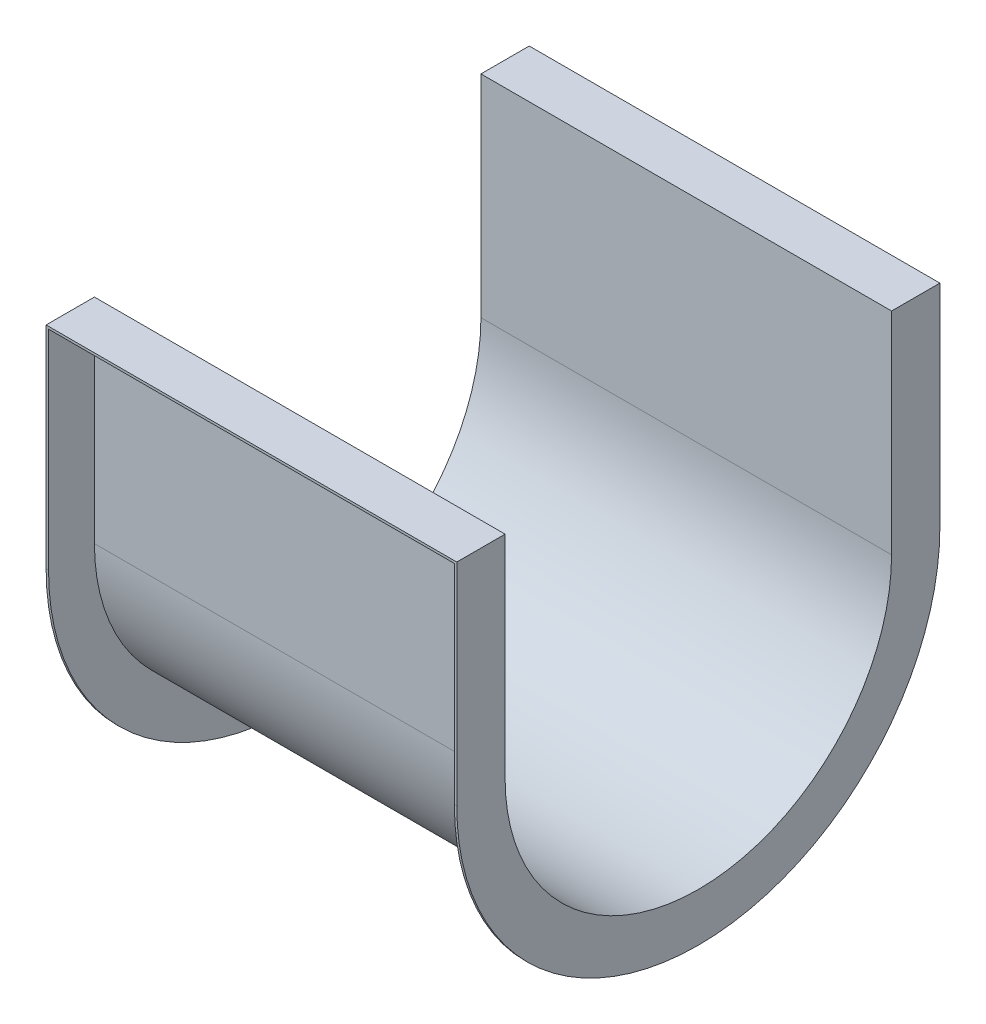
ISO-10303-21;
HEADER;
FILE_DESCRIPTION(('STEP AP214'),'2;1');
FILE_NAME('part.step','',(''),(''),'','','');
FILE_SCHEMA(('AUTOMOTIVE_DESIGN { 1 0 10303 214 1 1 1 1 }'));
ENDSEC;
DATA;
#1=APPLICATION_CONTEXT('core data for automotive mechanical design processes');
#2=APPLICATION_PROTOCOL_DEFINITION('international standard','automotive_design',2000,#1);
#3=PRODUCT_CONTEXT('',#1,'mechanical');
#4=PRODUCT('Part','Part','',(#3));
#5=PRODUCT_RELATED_PRODUCT_CATEGORY('part','',(#4));
#6=PRODUCT_DEFINITION_FORMATION('','',#4);
#7=PRODUCT_DEFINITION_CONTEXT('part definition',#1,'design');
#8=PRODUCT_DEFINITION('design','',#6,#7);
#9=PRODUCT_DEFINITION_SHAPE('','',#8);
#10=(LENGTH_UNIT() NAMED_UNIT(*) SI_UNIT(.MILLI.,.METRE.));
#11=(NAMED_UNIT(*) PLANE_ANGLE_UNIT() SI_UNIT($,.RADIAN.));
#12=(NAMED_UNIT(*) SI_UNIT($,.STERADIAN.) SOLID_ANGLE_UNIT());
#13=UNCERTAINTY_MEASURE_WITH_UNIT(LENGTH_MEASURE(1.E-05),#10,'distance_accuracy_value','');
#14=(GEOMETRIC_REPRESENTATION_CONTEXT(3) GLOBAL_UNCERTAINTY_ASSIGNED_CONTEXT((#13)) GLOBAL_UNIT_ASSIGNED_CONTEXT((#10,
#11,#12)) REPRESENTATION_CONTEXT('',''));
#15=CARTESIAN_POINT('',(0.,0.,0.));
#16=DIRECTION('',(0.,0.,1.));
#17=DIRECTION('',(1.,0.,0.));
#18=AXIS2_PLACEMENT_3D('',#15,#16,#17);
#19=CARTESIAN_POINT('',(170.,0.,-100.));
#20=DIRECTION('',(0.,0.,1.));
#21=DIRECTION('',(0.,-1.,0.));
#22=AXIS2_PLACEMENT_3D('',#19,#20,#21);
#23=PLANE('',#22);
#24=DIRECTION('',(0.,1.,0.));
#25=VECTOR('',#24,1.);
#26=CARTESIAN_POINT('',(1.,0.,-100.));
#27=LINE('',#26,#25);
#28=CARTESIAN_POINT('',(1.,-83.7,-100.));
#29=VERTEX_POINT('',#28);
#30=CARTESIAN_POINT('',(1.,2.7,-100.));
#31=VERTEX_POINT('',#30);
#32=EDGE_CURVE('E164',#29,#31,#27,.T.);
#33=ORIENTED_EDGE('',*,*,#32,.F.);
#34=DIRECTION('',(-1.,0.,0.));
#35=VECTOR('',#34,1.);
#36=CARTESIAN_POINT('',(170.,-83.7,-100.));
#37=LINE('',#36,#35);
#38=CARTESIAN_POINT('',(0.,-83.7,-100.));
#39=VERTEX_POINT('',#38);
#40=EDGE_CURVE('E78',#29,#39,#37,.T.);
#41=ORIENTED_EDGE('',*,*,#40,.T.);
#42=DIRECTION('',(0.,1.,0.));
#43=VECTOR('',#42,1.);
#44=CARTESIAN_POINT('',(0.,0.,-100.));
#45=LINE('',#44,#43);
#46=CARTESIAN_POINT('',(0.,3.7,-100.));
#47=VERTEX_POINT('',#46);
#48=EDGE_CURVE('E227',#39,#47,#45,.T.);
#49=ORIENTED_EDGE('',*,*,#48,.T.);
#50=DIRECTION('',(-1.,0.,0.));
#51=VECTOR('',#50,1.);
#52=CARTESIAN_POINT('',(0.,3.7,-100.));
#53=LINE('',#52,#51);
#54=CARTESIAN_POINT('',(170.,3.7,-100.));
#55=VERTEX_POINT('',#54);
#56=EDGE_CURVE('E224',#55,#47,#53,.T.);
#57=ORIENTED_EDGE('',*,*,#56,.F.);
#58=DIRECTION('',(0.,1.,0.));
#59=VECTOR('',#58,1.);
#60=CARTESIAN_POINT('',(170.,0.,-100.));
#61=LINE('',#60,#59);
#62=CARTESIAN_POINT('',(170.,-83.7,-100.));
#63=VERTEX_POINT('',#62);
#64=EDGE_CURVE('E228',#63,#55,#61,.T.);
#65=ORIENTED_EDGE('',*,*,#64,.F.);
#66=CARTESIAN_POINT('',(169.,-83.7,-100.));
#67=VERTEX_POINT('',#66);
#68=EDGE_CURVE('E251',#63,#67,#37,.T.);
#69=ORIENTED_EDGE('',*,*,#68,.T.);
#70=DIRECTION('',(0.,1.,0.));
#71=VECTOR('',#70,1.);
#72=CARTESIAN_POINT('',(169.,0.,-100.));
#73=LINE('',#72,#71);
#74=CARTESIAN_POINT('',(169.,2.7,-100.));
#75=VERTEX_POINT('',#74);
#76=EDGE_CURVE('E47',#67,#75,#73,.T.);
#77=ORIENTED_EDGE('',*,*,#76,.T.);
#78=DIRECTION('',(-1.,0.,0.));
#79=VECTOR('',#78,1.);
#80=CARTESIAN_POINT('',(170.,2.7,-100.));
#81=LINE('',#80,#79);
#82=EDGE_CURVE('E201',#75,#31,#81,.T.);
#83=ORIENTED_EDGE('',*,*,#82,.T.);
#84=EDGE_LOOP('',(#33,#41,#49,#57,#65,#69,#77,#83));
#85=FACE_BOUND('',#84,.T.);
#86=ADVANCED_FACE('F33',(#85),#23,.F.);
#87=CARTESIAN_POINT('',(170.,0.,100.));
#88=DIRECTION('',(0.,0.,-1.));
#89=DIRECTION('',(0.,1.,0.));
#90=AXIS2_PLACEMENT_3D('',#87,#88,#89);
#91=PLANE('',#90);
#92=DIRECTION('',(0.,-1.,0.));
#93=VECTOR('',#92,1.);
#94=CARTESIAN_POINT('',(1.,0.,100.));
#95=LINE('',#94,#93);
#96=CARTESIAN_POINT('',(1.,2.7,100.));
#97=VERTEX_POINT('',#96);
#98=CARTESIAN_POINT('',(1.,-83.7,100.));
#99=VERTEX_POINT('',#98);
#100=EDGE_CURVE('E196',#97,#99,#95,.T.);
#101=ORIENTED_EDGE('',*,*,#100,.F.);
#102=DIRECTION('',(1.,0.,0.));
#103=VECTOR('',#102,1.);
#104=CARTESIAN_POINT('',(0.,2.7,100.));
#105=LINE('',#104,#103);
#106=CARTESIAN_POINT('',(169.,2.7,100.));
#107=VERTEX_POINT('',#106);
#108=EDGE_CURVE('E175',#97,#107,#105,.T.);
#109=ORIENTED_EDGE('',*,*,#108,.T.);
#110=DIRECTION('',(0.,-1.,0.));
#111=VECTOR('',#110,1.);
#112=CARTESIAN_POINT('',(169.,0.,100.));
#113=LINE('',#112,#111);
#114=CARTESIAN_POINT('',(169.,-83.7,100.));
#115=VERTEX_POINT('',#114);
#116=EDGE_CURVE('E192',#107,#115,#113,.T.);
#117=ORIENTED_EDGE('',*,*,#116,.T.);
#118=DIRECTION('',(-1.,0.,0.));
#119=VECTOR('',#118,1.);
#120=CARTESIAN_POINT('',(170.,-83.7,100.));
#121=LINE('',#120,#119);
#122=CARTESIAN_POINT('',(170.,-83.7,100.));
#123=VERTEX_POINT('',#122);
#124=EDGE_CURVE('E255',#123,#115,#121,.T.);
#125=ORIENTED_EDGE('',*,*,#124,.F.);
#126=DIRECTION('',(0.,-1.,0.));
#127=VECTOR('',#126,1.);
#128=CARTESIAN_POINT('',(170.,0.,100.));
#129=LINE('',#128,#127);
#130=CARTESIAN_POINT('',(170.,3.7,100.));
#131=VERTEX_POINT('',#130);
#132=EDGE_CURVE('E236',#131,#123,#129,.T.);
#133=ORIENTED_EDGE('',*,*,#132,.F.);
#134=DIRECTION('',(1.,0.,0.));
#135=VECTOR('',#134,1.);
#136=CARTESIAN_POINT('',(170.,3.7,100.));
#137=LINE('',#136,#135);
#138=CARTESIAN_POINT('',(0.,3.7,100.));
#139=VERTEX_POINT('',#138);
#140=EDGE_CURVE('E212',#139,#131,#137,.T.);
#141=ORIENTED_EDGE('',*,*,#140,.F.);
#142=DIRECTION('',(0.,-1.,0.));
#143=VECTOR('',#142,1.);
#144=CARTESIAN_POINT('',(0.,0.,100.));
#145=LINE('',#144,#143);
#146=CARTESIAN_POINT('',(0.,-83.7,100.));
#147=VERTEX_POINT('',#146);
#148=EDGE_CURVE('E247',#139,#147,#145,.T.);
#149=ORIENTED_EDGE('',*,*,#148,.T.);
#150=EDGE_CURVE('E254',#99,#147,#121,.T.);
#151=ORIENTED_EDGE('',*,*,#150,.F.);
#152=EDGE_LOOP('',(#101,#109,#117,#125,#133,#141,#149,#151));
#153=FACE_BOUND('',#152,.T.);
#154=ADVANCED_FACE('F277',(#153),#91,.F.);
#155=CARTESIAN_POINT('',(170.,-83.7,0.));
#156=DIRECTION('',(-1.,0.,0.));
#157=DIRECTION('',(0.,0.,1.));
#158=AXIS2_PLACEMENT_3D('',#155,#156,#157);
#159=CYLINDRICAL_SURFACE('',#158,100.);
#160=CARTESIAN_POINT('',(1.,-83.7,0.));
#161=DIRECTION('',(1.,0.,0.));
#162=DIRECTION('',(0.,0.,-1.));
#163=AXIS2_PLACEMENT_3D('',#160,#161,#162);
#164=CIRCLE('',#163,100.);
#165=EDGE_CURVE('E188',#99,#29,#164,.T.);
#166=ORIENTED_EDGE('',*,*,#165,.F.);
#167=ORIENTED_EDGE('',*,*,#150,.T.);
#168=CARTESIAN_POINT('',(0.,-83.7,0.));
#169=DIRECTION('',(1.,0.,0.));
#170=DIRECTION('',(0.,0.,-1.));
#171=AXIS2_PLACEMENT_3D('',#168,#169,#170);
#172=CIRCLE('',#171,100.);
#173=EDGE_CURVE('E230',#147,#39,#172,.T.);
#174=ORIENTED_EDGE('',*,*,#173,.T.);
#175=ORIENTED_EDGE('',*,*,#40,.F.);
#176=EDGE_LOOP('',(#166,#167,#174,#175));
#177=FACE_BOUND('',#176,.T.);
#178=ADVANCED_FACE('F312',(#177),#159,.T.);
#179=CARTESIAN_POINT('',(170.,0.,-80.));
#180=DIRECTION('',(0.,0.,-1.));
#181=DIRECTION('',(-1.,0.,0.));
#182=AXIS2_PLACEMENT_3D('',#179,#180,#181);
#183=PLANE('',#182);
#184=DIRECTION('',(0.,-1.,0.));
#185=VECTOR('',#184,1.);
#186=CARTESIAN_POINT('',(0.,0.,-80.));
#187=LINE('',#186,#185);
#188=CARTESIAN_POINT('',(0.,3.7,-80.));
#189=VERTEX_POINT('',#188);
#190=CARTESIAN_POINT('',(0.,-83.7,-80.));
#191=VERTEX_POINT('',#190);
#192=EDGE_CURVE('E240',#189,#191,#187,.T.);
#193=ORIENTED_EDGE('',*,*,#192,.T.);
#194=DIRECTION('',(-1.,0.,0.));
#195=VECTOR('',#194,1.);
#196=CARTESIAN_POINT('',(170.,-83.7,-80.));
#197=LINE('',#196,#195);
#198=CARTESIAN_POINT('',(170.,-83.7,-80.));
#199=VERTEX_POINT('',#198);
#200=EDGE_CURVE('E11',#199,#191,#197,.T.);
#201=ORIENTED_EDGE('',*,*,#200,.F.);
#202=DIRECTION('',(0.,-1.,0.));
#203=VECTOR('',#202,1.);
#204=CARTESIAN_POINT('',(170.,0.,-80.));
#205=LINE('',#204,#203);
#206=CARTESIAN_POINT('',(170.,3.7,-80.));
#207=VERTEX_POINT('',#206);
#208=EDGE_CURVE('E85',#207,#199,#205,.T.);
#209=ORIENTED_EDGE('',*,*,#208,.F.);
#210=DIRECTION('',(1.,0.,0.));
#211=VECTOR('',#210,1.);
#212=CARTESIAN_POINT('',(0.,3.7,-80.));
#213=LINE('',#212,#211);
#214=EDGE_CURVE('E218',#189,#207,#213,.T.);
#215=ORIENTED_EDGE('',*,*,#214,.F.);
#216=EDGE_LOOP('',(#193,#201,#209,#215));
#217=FACE_BOUND('',#216,.T.);
#218=ADVANCED_FACE('F283',(#217),#183,.F.);
#219=CARTESIAN_POINT('',(170.,-83.7,0.));
#220=DIRECTION('',(-1.,0.,0.));
#221=DIRECTION('',(0.,0.,1.));
#222=AXIS2_PLACEMENT_3D('',#219,#220,#221);
#223=CYLINDRICAL_SURFACE('',#222,80.);
#224=CARTESIAN_POINT('',(0.,-83.7,0.));
#225=DIRECTION('',(-1.,0.,0.));
#226=DIRECTION('',(0.,0.,1.));
#227=AXIS2_PLACEMENT_3D('',#224,#225,#226);
#228=CIRCLE('',#227,80.);
#229=CARTESIAN_POINT('',(0.,-83.7,80.));
#230=VERTEX_POINT('',#229);
#231=EDGE_CURVE('E243',#191,#230,#228,.T.);
#232=ORIENTED_EDGE('',*,*,#231,.T.);
#233=DIRECTION('',(-1.,0.,0.));
#234=VECTOR('',#233,1.);
#235=CARTESIAN_POINT('',(170.,-83.7,80.));
#236=LINE('',#235,#234);
#237=CARTESIAN_POINT('',(170.,-83.7,80.));
#238=VERTEX_POINT('',#237);
#239=EDGE_CURVE('E40',#238,#230,#236,.T.);
#240=ORIENTED_EDGE('',*,*,#239,.F.);
#241=CARTESIAN_POINT('',(170.,-83.7,0.));
#242=DIRECTION('',(-1.,0.,0.));
#243=DIRECTION('',(0.,0.,-1.));
#244=AXIS2_PLACEMENT_3D('',#241,#242,#243);
#245=CIRCLE('',#244,80.);
#246=EDGE_CURVE('E232',#199,#238,#245,.T.);
#247=ORIENTED_EDGE('',*,*,#246,.F.);
#248=ORIENTED_EDGE('',*,*,#200,.T.);
#249=EDGE_LOOP('',(#232,#240,#247,#248));
#250=FACE_BOUND('',#249,.T.);
#251=ADVANCED_FACE('F281',(#250),#223,.F.);
#252=CARTESIAN_POINT('',(170.,0.,80.));
#253=DIRECTION('',(0.,0.,1.));
#254=DIRECTION('',(0.,-1.,0.));
#255=AXIS2_PLACEMENT_3D('',#252,#253,#254);
#256=PLANE('',#255);
#257=DIRECTION('',(0.,1.,0.));
#258=VECTOR('',#257,1.);
#259=CARTESIAN_POINT('',(0.,0.,80.));
#260=LINE('',#259,#258);
#261=CARTESIAN_POINT('',(0.,3.7,80.));
#262=VERTEX_POINT('',#261);
#263=EDGE_CURVE('E245',#230,#262,#260,.T.);
#264=ORIENTED_EDGE('',*,*,#263,.T.);
#265=DIRECTION('',(-1.,0.,0.));
#266=VECTOR('',#265,1.);
#267=CARTESIAN_POINT('',(170.,3.7,80.));
#268=LINE('',#267,#266);
#269=CARTESIAN_POINT('',(170.,3.7,80.));
#270=VERTEX_POINT('',#269);
#271=EDGE_CURVE('E206',#270,#262,#268,.T.);
#272=ORIENTED_EDGE('',*,*,#271,.F.);
#273=DIRECTION('',(0.,1.,0.));
#274=VECTOR('',#273,1.);
#275=CARTESIAN_POINT('',(170.,0.,80.));
#276=LINE('',#275,#274);
#277=EDGE_CURVE('E234',#238,#270,#276,.T.);
#278=ORIENTED_EDGE('',*,*,#277,.F.);
#279=ORIENTED_EDGE('',*,*,#239,.T.);
#280=EDGE_LOOP('',(#264,#272,#278,#279));
#281=FACE_BOUND('',#280,.T.);
#282=ADVANCED_FACE('F262',(#281),#256,.F.);
#283=ORIENTED_EDGE('',*,*,#124,.T.);
#284=CARTESIAN_POINT('',(169.,-83.7,0.));
#285=DIRECTION('',(1.,0.,0.));
#286=DIRECTION('',(0.,0.,-1.));
#287=AXIS2_PLACEMENT_3D('',#284,#285,#286);
#288=CIRCLE('',#287,100.);
#289=EDGE_CURVE('E189',#115,#67,#288,.T.);
#290=ORIENTED_EDGE('',*,*,#289,.T.);
#291=ORIENTED_EDGE('',*,*,#68,.F.);
#292=CARTESIAN_POINT('',(170.,-83.7,0.));
#293=DIRECTION('',(1.,0.,0.));
#294=DIRECTION('',(0.,0.,1.));
#295=AXIS2_PLACEMENT_3D('',#292,#293,#294);
#296=CIRCLE('',#295,100.);
#297=EDGE_CURVE('E56',#123,#63,#296,.T.);
#298=ORIENTED_EDGE('',*,*,#297,.F.);
#299=EDGE_LOOP('',(#283,#290,#291,#298));
#300=FACE_BOUND('',#299,.T.);
#301=ADVANCED_FACE('F291',(#300),#159,.T.);
#302=CARTESIAN_POINT('',(170.,-83.7,0.));
#303=DIRECTION('',(1.,0.,0.));
#304=DIRECTION('',(0.,0.,-1.));
#305=AXIS2_PLACEMENT_3D('',#302,#303,#304);
#306=PLANE('',#305);
#307=ORIENTED_EDGE('',*,*,#64,.T.);
#308=DIRECTION('',(0.,0.,-1.));
#309=VECTOR('',#308,1.);
#310=CARTESIAN_POINT('',(170.,3.7,-100.));
#311=LINE('',#310,#309);
#312=EDGE_CURVE('E221',#207,#55,#311,.T.);
#313=ORIENTED_EDGE('',*,*,#312,.F.);
#314=ORIENTED_EDGE('',*,*,#208,.T.);
#315=ORIENTED_EDGE('',*,*,#246,.T.);
#316=ORIENTED_EDGE('',*,*,#277,.T.);
#317=DIRECTION('',(0.,0.,-1.));
#318=VECTOR('',#317,1.);
#319=CARTESIAN_POINT('',(170.,3.7,80.));
#320=LINE('',#319,#318);
#321=EDGE_CURVE('E203',#131,#270,#320,.T.);
#322=ORIENTED_EDGE('',*,*,#321,.F.);
#323=ORIENTED_EDGE('',*,*,#132,.T.);
#324=ORIENTED_EDGE('',*,*,#297,.T.);
#325=EDGE_LOOP('',(#307,#313,#314,#315,#316,#322,#323,#324));
#326=FACE_BOUND('',#325,.T.);
#327=ADVANCED_FACE('F280',(#326),#306,.T.);
#328=CARTESIAN_POINT('',(0.,-83.7,0.));
#329=DIRECTION('',(1.,0.,0.));
#330=DIRECTION('',(0.,0.,-1.));
#331=AXIS2_PLACEMENT_3D('',#328,#329,#330);
#332=PLANE('',#331);
#333=ORIENTED_EDGE('',*,*,#48,.F.);
#334=ORIENTED_EDGE('',*,*,#173,.F.);
#335=ORIENTED_EDGE('',*,*,#148,.F.);
#336=DIRECTION('',(0.,0.,1.));
#337=VECTOR('',#336,1.);
#338=CARTESIAN_POINT('',(0.,3.7,80.));
#339=LINE('',#338,#337);
#340=EDGE_CURVE('E209',#262,#139,#339,.T.);
#341=ORIENTED_EDGE('',*,*,#340,.F.);
#342=ORIENTED_EDGE('',*,*,#263,.F.);
#343=ORIENTED_EDGE('',*,*,#231,.F.);
#344=ORIENTED_EDGE('',*,*,#192,.F.);
#345=DIRECTION('',(0.,0.,1.));
#346=VECTOR('',#345,1.);
#347=CARTESIAN_POINT('',(0.,3.7,-100.));
#348=LINE('',#347,#346);
#349=EDGE_CURVE('E215',#47,#189,#348,.T.);
#350=ORIENTED_EDGE('',*,*,#349,.F.);
#351=EDGE_LOOP('',(#333,#334,#335,#341,#342,#343,#344,#350));
#352=FACE_BOUND('',#351,.T.);
#353=ADVANCED_FACE('F269',(#352),#332,.F.);
#354=CARTESIAN_POINT('',(0.,3.7,0.));
#355=DIRECTION('',(0.,1.,0.));
#356=DIRECTION('',(0.,0.,1.));
#357=AXIS2_PLACEMENT_3D('',#354,#355,#356);
#358=PLANE('',#357);
#359=ORIENTED_EDGE('',*,*,#349,.T.);
#360=ORIENTED_EDGE('',*,*,#214,.T.);
#361=ORIENTED_EDGE('',*,*,#312,.T.);
#362=ORIENTED_EDGE('',*,*,#56,.T.);
#363=EDGE_LOOP('',(#359,#360,#361,#362));
#364=FACE_BOUND('',#363,.T.);
#365=ADVANCED_FACE('F287',(#364),#358,.T.);
#366=CARTESIAN_POINT('',(0.,3.7,0.));
#367=DIRECTION('',(0.,-1.,0.));
#368=DIRECTION('',(0.,0.,-1.));
#369=AXIS2_PLACEMENT_3D('',#366,#367,#368);
#370=PLANE('',#369);
#371=ORIENTED_EDGE('',*,*,#321,.T.);
#372=ORIENTED_EDGE('',*,*,#271,.T.);
#373=ORIENTED_EDGE('',*,*,#340,.T.);
#374=ORIENTED_EDGE('',*,*,#140,.T.);
#375=EDGE_LOOP('',(#371,#372,#373,#374));
#376=FACE_BOUND('',#375,.T.);
#377=ADVANCED_FACE('F273',(#376),#370,.F.);
#378=CARTESIAN_POINT('',(170.,0.,-81.));
#379=DIRECTION('',(0.,0.,-1.));
#380=DIRECTION('',(-1.,0.,0.));
#381=AXIS2_PLACEMENT_3D('',#378,#379,#380);
#382=PLANE('',#381);
#383=DIRECTION('',(0.,-1.,0.));
#384=VECTOR('',#383,1.);
#385=CARTESIAN_POINT('',(1.,0.,-81.));
#386=LINE('',#385,#384);
#387=CARTESIAN_POINT('',(1.,2.7,-81.));
#388=VERTEX_POINT('',#387);
#389=CARTESIAN_POINT('',(1.,-83.7,-81.));
#390=VERTEX_POINT('',#389);
#391=EDGE_CURVE('E154',#388,#390,#386,.T.);
#392=ORIENTED_EDGE('',*,*,#391,.F.);
#393=DIRECTION('',(1.,0.,0.));
#394=VECTOR('',#393,1.);
#395=CARTESIAN_POINT('',(170.,2.7,-81.));
#396=LINE('',#395,#394);
#397=CARTESIAN_POINT('',(169.,2.7,-81.));
#398=VERTEX_POINT('',#397);
#399=EDGE_CURVE('E157',#388,#398,#396,.T.);
#400=ORIENTED_EDGE('',*,*,#399,.T.);
#401=DIRECTION('',(0.,-1.,0.));
#402=VECTOR('',#401,1.);
#403=CARTESIAN_POINT('',(169.,0.,-81.));
#404=LINE('',#403,#402);
#405=CARTESIAN_POINT('',(169.,-83.7,-81.));
#406=VERTEX_POINT('',#405);
#407=EDGE_CURVE('E187',#398,#406,#404,.T.);
#408=ORIENTED_EDGE('',*,*,#407,.T.);
#409=DIRECTION('',(-1.,0.,0.));
#410=VECTOR('',#409,1.);
#411=CARTESIAN_POINT('',(170.,-83.7,-81.));
#412=LINE('',#411,#410);
#413=EDGE_CURVE('E160',#406,#390,#412,.T.);
#414=ORIENTED_EDGE('',*,*,#413,.T.);
#415=EDGE_LOOP('',(#392,#400,#408,#414));
#416=FACE_BOUND('',#415,.T.);
#417=ADVANCED_FACE('F156',(#416),#382,.T.);
#418=CARTESIAN_POINT('',(170.,-83.7,0.));
#419=DIRECTION('',(-1.,0.,0.));
#420=DIRECTION('',(0.,0.,1.));
#421=AXIS2_PLACEMENT_3D('',#418,#419,#420);
#422=CYLINDRICAL_SURFACE('',#421,81.);
#423=CARTESIAN_POINT('',(1.,-83.7,0.));
#424=DIRECTION('',(1.,0.,0.));
#425=DIRECTION('',(0.,0.,-1.));
#426=AXIS2_PLACEMENT_3D('',#423,#424,#425);
#427=CIRCLE('',#426,81.);
#428=CARTESIAN_POINT('',(1.,-83.7,81.));
#429=VERTEX_POINT('',#428);
#430=EDGE_CURVE('E163',#390,#429,#427,.F.);
#431=ORIENTED_EDGE('',*,*,#430,.F.);
#432=ORIENTED_EDGE('',*,*,#413,.F.);
#433=CARTESIAN_POINT('',(169.,-83.7,0.));
#434=DIRECTION('',(1.,0.,0.));
#435=DIRECTION('',(0.,0.,-1.));
#436=AXIS2_PLACEMENT_3D('',#433,#434,#435);
#437=CIRCLE('',#436,81.);
#438=CARTESIAN_POINT('',(169.,-83.7,81.));
#439=VERTEX_POINT('',#438);
#440=EDGE_CURVE('E308',#406,#439,#437,.F.);
#441=ORIENTED_EDGE('',*,*,#440,.T.);
#442=DIRECTION('',(1.,0.,0.));
#443=VECTOR('',#442,1.);
#444=CARTESIAN_POINT('',(170.,-83.7,81.));
#445=LINE('',#444,#443);
#446=EDGE_CURVE('E191',#439,#429,#445,.F.);
#447=ORIENTED_EDGE('',*,*,#446,.T.);
#448=EDGE_LOOP('',(#431,#432,#441,#447));
#449=FACE_BOUND('',#448,.T.);
#450=ADVANCED_FACE('F320',(#449),#422,.T.);
#451=CARTESIAN_POINT('',(170.,0.,81.));
#452=DIRECTION('',(0.,0.,1.));
#453=DIRECTION('',(0.,-1.,0.));
#454=AXIS2_PLACEMENT_3D('',#451,#452,#453);
#455=PLANE('',#454);
#456=DIRECTION('',(0.,1.,0.));
#457=VECTOR('',#456,1.);
#458=CARTESIAN_POINT('',(1.,0.,81.));
#459=LINE('',#458,#457);
#460=CARTESIAN_POINT('',(1.,2.7,81.));
#461=VERTEX_POINT('',#460);
#462=EDGE_CURVE('E198',#429,#461,#459,.T.);
#463=ORIENTED_EDGE('',*,*,#462,.F.);
#464=ORIENTED_EDGE('',*,*,#446,.F.);
#465=DIRECTION('',(0.,1.,0.));
#466=VECTOR('',#465,1.);
#467=CARTESIAN_POINT('',(169.,0.,81.));
#468=LINE('',#467,#466);
#469=CARTESIAN_POINT('',(169.,2.7,81.));
#470=VERTEX_POINT('',#469);
#471=EDGE_CURVE('E194',#439,#470,#468,.T.);
#472=ORIENTED_EDGE('',*,*,#471,.T.);
#473=DIRECTION('',(-1.,0.,0.));
#474=VECTOR('',#473,1.);
#475=CARTESIAN_POINT('',(0.,2.7,81.));
#476=LINE('',#475,#474);
#477=EDGE_CURVE('E185',#470,#461,#476,.T.);
#478=ORIENTED_EDGE('',*,*,#477,.T.);
#479=EDGE_LOOP('',(#463,#464,#472,#478));
#480=FACE_BOUND('',#479,.T.);
#481=ADVANCED_FACE('F321',(#480),#455,.T.);
#482=CARTESIAN_POINT('',(169.,-83.7,0.));
#483=DIRECTION('',(1.,0.,0.));
#484=DIRECTION('',(0.,0.,-1.));
#485=AXIS2_PLACEMENT_3D('',#482,#483,#484);
#486=PLANE('',#485);
#487=ORIENTED_EDGE('',*,*,#76,.F.);
#488=ORIENTED_EDGE('',*,*,#289,.F.);
#489=ORIENTED_EDGE('',*,*,#116,.F.);
#490=DIRECTION('',(0.,0.,-1.));
#491=VECTOR('',#490,1.);
#492=CARTESIAN_POINT('',(169.,2.69999999999999,0.));
#493=LINE('',#492,#491);
#494=EDGE_CURVE('E182',#107,#470,#493,.T.);
#495=ORIENTED_EDGE('',*,*,#494,.T.);
#496=ORIENTED_EDGE('',*,*,#471,.F.);
#497=ORIENTED_EDGE('',*,*,#440,.F.);
#498=ORIENTED_EDGE('',*,*,#407,.F.);
#499=DIRECTION('',(0.,0.,-1.));
#500=VECTOR('',#499,1.);
#501=CARTESIAN_POINT('',(169.,2.7,0.));
#502=LINE('',#501,#500);
#503=EDGE_CURVE('E172',#398,#75,#502,.T.);
#504=ORIENTED_EDGE('',*,*,#503,.T.);
#505=EDGE_LOOP('',(#487,#488,#489,#495,#496,#497,#498,#504));
#506=FACE_BOUND('',#505,.T.);
#507=ADVANCED_FACE('F292',(#506),#486,.F.);
#508=CARTESIAN_POINT('',(1.,-83.7,0.));
#509=DIRECTION('',(1.,0.,0.));
#510=DIRECTION('',(0.,0.,-1.));
#511=AXIS2_PLACEMENT_3D('',#508,#509,#510);
#512=PLANE('',#511);
#513=ORIENTED_EDGE('',*,*,#32,.T.);
#514=DIRECTION('',(0.,0.,1.));
#515=VECTOR('',#514,1.);
#516=CARTESIAN_POINT('',(1.,2.69999999999999,0.));
#517=LINE('',#516,#515);
#518=EDGE_CURVE('E170',#31,#388,#517,.T.);
#519=ORIENTED_EDGE('',*,*,#518,.T.);
#520=ORIENTED_EDGE('',*,*,#391,.T.);
#521=ORIENTED_EDGE('',*,*,#430,.T.);
#522=ORIENTED_EDGE('',*,*,#462,.T.);
#523=DIRECTION('',(0.,0.,1.));
#524=VECTOR('',#523,1.);
#525=CARTESIAN_POINT('',(1.,2.7,0.));
#526=LINE('',#525,#524);
#527=EDGE_CURVE('E178',#461,#97,#526,.T.);
#528=ORIENTED_EDGE('',*,*,#527,.T.);
#529=ORIENTED_EDGE('',*,*,#100,.T.);
#530=ORIENTED_EDGE('',*,*,#165,.T.);
#531=EDGE_LOOP('',(#513,#519,#520,#521,#522,#528,#529,#530));
#532=FACE_BOUND('',#531,.T.);
#533=ADVANCED_FACE('F174',(#532),#512,.T.);
#534=CARTESIAN_POINT('',(0.,2.7,0.));
#535=DIRECTION('',(0.,1.,0.));
#536=DIRECTION('',(0.,0.,1.));
#537=AXIS2_PLACEMENT_3D('',#534,#535,#536);
#538=PLANE('',#537);
#539=ORIENTED_EDGE('',*,*,#518,.F.);
#540=ORIENTED_EDGE('',*,*,#82,.F.);
#541=ORIENTED_EDGE('',*,*,#503,.F.);
#542=ORIENTED_EDGE('',*,*,#399,.F.);
#543=EDGE_LOOP('',(#539,#540,#541,#542));
#544=FACE_BOUND('',#543,.T.);
#545=ADVANCED_FACE('F168',(#544),#538,.F.);
#546=CARTESIAN_POINT('',(0.,2.7,0.));
#547=DIRECTION('',(0.,-1.,0.));
#548=DIRECTION('',(0.,0.,-1.));
#549=AXIS2_PLACEMENT_3D('',#546,#547,#548);
#550=PLANE('',#549);
#551=ORIENTED_EDGE('',*,*,#494,.F.);
#552=ORIENTED_EDGE('',*,*,#108,.F.);
#553=ORIENTED_EDGE('',*,*,#527,.F.);
#554=ORIENTED_EDGE('',*,*,#477,.F.);
#555=EDGE_LOOP('',(#551,#552,#553,#554));
#556=FACE_BOUND('',#555,.T.);
#557=ADVANCED_FACE('F298',(#556),#550,.T.);
#558=CLOSED_SHELL('',(#86,#154,#178,#218,#251,#282,#301,#327,#353,#365,#377,#417,#450,#481,#507,
#533,#545,#557));
#559=MANIFOLD_SOLID_BREP('B2',#558);
#560=ADVANCED_BREP_SHAPE_REPRESENTATION('',(#18,#559),#14);
#561=SHAPE_DEFINITION_REPRESENTATION(#9,#560);
ENDSEC;
END-ISO-10303-21;
